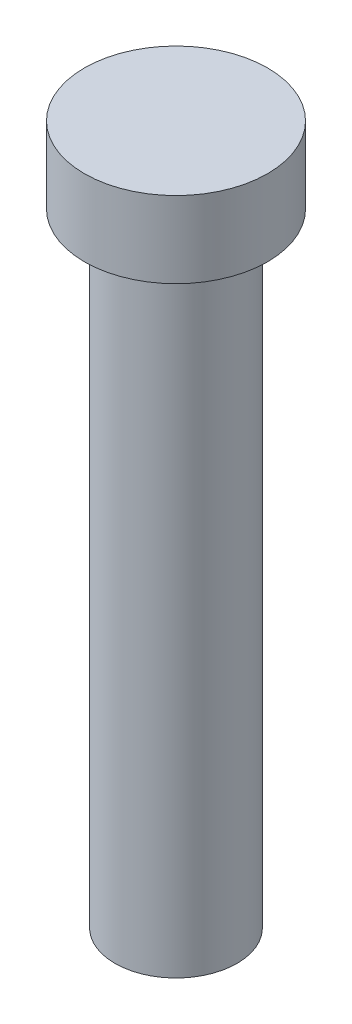
ISO-10303-21;
HEADER;
FILE_DESCRIPTION(('STEP AP214'),'2;1');
FILE_NAME('part.step','',(''),(''),'','','');
FILE_SCHEMA(('AUTOMOTIVE_DESIGN { 1 0 10303 214 1 1 1 1 }'));
ENDSEC;
DATA;
#1=APPLICATION_CONTEXT('core data for automotive mechanical design processes');
#2=APPLICATION_PROTOCOL_DEFINITION('international standard','automotive_design',2000,#1);
#3=PRODUCT_CONTEXT('',#1,'mechanical');
#4=PRODUCT('Part','Part','',(#3));
#5=PRODUCT_RELATED_PRODUCT_CATEGORY('part','',(#4));
#6=PRODUCT_DEFINITION_FORMATION('','',#4);
#7=PRODUCT_DEFINITION_CONTEXT('part definition',#1,'design');
#8=PRODUCT_DEFINITION('design','',#6,#7);
#9=PRODUCT_DEFINITION_SHAPE('','',#8);
#10=(LENGTH_UNIT() NAMED_UNIT(*) SI_UNIT(.MILLI.,.METRE.));
#11=(NAMED_UNIT(*) PLANE_ANGLE_UNIT() SI_UNIT($,.RADIAN.));
#12=(NAMED_UNIT(*) SI_UNIT($,.STERADIAN.) SOLID_ANGLE_UNIT());
#13=UNCERTAINTY_MEASURE_WITH_UNIT(LENGTH_MEASURE(1.E-05),#10,'distance_accuracy_value','');
#14=(GEOMETRIC_REPRESENTATION_CONTEXT(3) GLOBAL_UNCERTAINTY_ASSIGNED_CONTEXT((#13)) GLOBAL_UNIT_ASSIGNED_CONTEXT((#10,
#11,#12)) REPRESENTATION_CONTEXT('',''));
#15=CARTESIAN_POINT('',(0.,0.,0.));
#16=DIRECTION('',(0.,0.,1.));
#17=DIRECTION('',(1.,0.,0.));
#18=AXIS2_PLACEMENT_3D('',#15,#16,#17);
#19=CARTESIAN_POINT('',(0.,40.8,0.));
#20=DIRECTION('',(0.,-1.,0.));
#21=DIRECTION('',(0.,0.,-1.));
#22=AXIS2_PLACEMENT_3D('',#19,#20,#21);
#23=CYLINDRICAL_SURFACE('',#22,4.);
#24=CARTESIAN_POINT('',(0.,40.8,0.));
#25=DIRECTION('',(0.,1.,0.));
#26=DIRECTION('',(0.,0.,1.));
#27=AXIS2_PLACEMENT_3D('',#24,#25,#26);
#28=CIRCLE('',#27,4.);
#29=CARTESIAN_POINT('',(0.,40.8,4.));
#30=VERTEX_POINT('',#29);
#31=EDGE_CURVE('E10',#30,#30,#28,.T.);
#32=ORIENTED_EDGE('',*,*,#31,.F.);
#33=EDGE_LOOP('',(#32));
#34=FACE_BOUND('',#33,.T.);
#35=CARTESIAN_POINT('',(0.,0.,0.));
#36=DIRECTION('',(0.,1.,0.));
#37=DIRECTION('',(0.,0.,1.));
#38=AXIS2_PLACEMENT_3D('',#35,#36,#37);
#39=CIRCLE('',#38,4.);
#40=CARTESIAN_POINT('',(0.,0.,4.));
#41=VERTEX_POINT('',#40);
#42=EDGE_CURVE('E33',#41,#41,#39,.T.);
#43=ORIENTED_EDGE('',*,*,#42,.T.);
#44=EDGE_LOOP('',(#43));
#45=FACE_BOUND('',#44,.T.);
#46=ADVANCED_FACE('F30',(#34,#45),#23,.T.);
#47=CARTESIAN_POINT('',(0.,0.,0.));
#48=DIRECTION('',(0.,1.,0.));
#49=DIRECTION('',(0.,0.,1.));
#50=AXIS2_PLACEMENT_3D('',#47,#48,#49);
#51=PLANE('',#50);
#52=CARTESIAN_POINT('',(0.,0.,0.));
#53=DIRECTION('',(0.,-1.,0.));
#54=DIRECTION('',(0.,0.,-1.));
#55=AXIS2_PLACEMENT_3D('',#52,#53,#54);
#56=CIRCLE('',#55,1.5);
#57=CARTESIAN_POINT('',(0.,0.,-1.5));
#58=VERTEX_POINT('',#57);
#59=EDGE_CURVE('E48',#58,#58,#56,.T.);
#60=ORIENTED_EDGE('',*,*,#59,.F.);
#61=EDGE_LOOP('',(#60));
#62=FACE_BOUND('',#61,.T.);
#63=ORIENTED_EDGE('',*,*,#42,.F.);
#64=EDGE_LOOP('',(#63));
#65=FACE_BOUND('',#64,.T.);
#66=ADVANCED_FACE('F63',(#62,#65),#51,.F.);
#67=CARTESIAN_POINT('',(0.,45.8,0.));
#68=DIRECTION('',(0.,-1.,0.));
#69=DIRECTION('',(0.,0.,-1.));
#70=AXIS2_PLACEMENT_3D('',#67,#68,#69);
#71=CYLINDRICAL_SURFACE('',#70,6.);
#72=CARTESIAN_POINT('',(0.,45.8,0.));
#73=DIRECTION('',(0.,1.,0.));
#74=DIRECTION('',(0.,0.,1.));
#75=AXIS2_PLACEMENT_3D('',#72,#73,#74);
#76=CIRCLE('',#75,6.);
#77=CARTESIAN_POINT('',(0.,45.8,6.));
#78=VERTEX_POINT('',#77);
#79=EDGE_CURVE('E40',#78,#78,#76,.T.);
#80=ORIENTED_EDGE('',*,*,#79,.F.);
#81=EDGE_LOOP('',(#80));
#82=FACE_BOUND('',#81,.T.);
#83=CARTESIAN_POINT('',(0.,40.8,0.));
#84=DIRECTION('',(0.,1.,0.));
#85=DIRECTION('',(0.,0.,1.));
#86=AXIS2_PLACEMENT_3D('',#83,#84,#85);
#87=CIRCLE('',#86,6.);
#88=CARTESIAN_POINT('',(0.,40.8,6.));
#89=VERTEX_POINT('',#88);
#90=EDGE_CURVE('E42',#89,#89,#87,.T.);
#91=ORIENTED_EDGE('',*,*,#90,.T.);
#92=EDGE_LOOP('',(#91));
#93=FACE_BOUND('',#92,.T.);
#94=ADVANCED_FACE('F66',(#82,#93),#71,.T.);
#95=CARTESIAN_POINT('',(0.,45.8,0.));
#96=DIRECTION('',(0.,1.,0.));
#97=DIRECTION('',(0.,0.,1.));
#98=AXIS2_PLACEMENT_3D('',#95,#96,#97);
#99=PLANE('',#98);
#100=ORIENTED_EDGE('',*,*,#79,.T.);
#101=EDGE_LOOP('',(#100));
#102=FACE_BOUND('',#101,.T.);
#103=ADVANCED_FACE('F85',(#102),#99,.T.);
#104=CARTESIAN_POINT('',(0.,40.8,0.));
#105=DIRECTION('',(0.,1.,0.));
#106=DIRECTION('',(0.,0.,1.));
#107=AXIS2_PLACEMENT_3D('',#104,#105,#106);
#108=PLANE('',#107);
#109=ORIENTED_EDGE('',*,*,#31,.T.);
#110=EDGE_LOOP('',(#109));
#111=FACE_BOUND('',#110,.T.);
#112=ORIENTED_EDGE('',*,*,#90,.F.);
#113=EDGE_LOOP('',(#112));
#114=FACE_BOUND('',#113,.T.);
#115=ADVANCED_FACE('F59',(#111,#114),#108,.F.);
#116=CARTESIAN_POINT('',(0.,15.,0.));
#117=DIRECTION('',(0.,-1.,0.));
#118=DIRECTION('',(0.,0.,-1.));
#119=AXIS2_PLACEMENT_3D('',#116,#117,#118);
#120=CYLINDRICAL_SURFACE('',#119,1.5);
#121=CARTESIAN_POINT('',(0.,15.,0.));
#122=DIRECTION('',(0.,-1.,0.));
#123=DIRECTION('',(0.,0.,-1.));
#124=AXIS2_PLACEMENT_3D('',#121,#122,#123);
#125=CIRCLE('',#124,1.5);
#126=CARTESIAN_POINT('',(0.,15.,-1.5));
#127=VERTEX_POINT('',#126);
#128=EDGE_CURVE('E45',#127,#127,#125,.T.);
#129=ORIENTED_EDGE('',*,*,#128,.F.);
#130=EDGE_LOOP('',(#129));
#131=FACE_BOUND('',#130,.T.);
#132=ORIENTED_EDGE('',*,*,#59,.T.);
#133=EDGE_LOOP('',(#132));
#134=FACE_BOUND('',#133,.T.);
#135=ADVANCED_FACE('F56',(#131,#134),#120,.F.);
#136=CARTESIAN_POINT('',(0.,15.,0.));
#137=DIRECTION('',(0.,-1.,0.));
#138=DIRECTION('',(0.,0.,-1.));
#139=AXIS2_PLACEMENT_3D('',#136,#137,#138);
#140=PLANE('',#139);
#141=ORIENTED_EDGE('',*,*,#128,.T.);
#142=EDGE_LOOP('',(#141));
#143=FACE_BOUND('',#142,.T.);
#144=ADVANCED_FACE('F54',(#143),#140,.T.);
#145=CLOSED_SHELL('',(#46,#66,#94,#103,#115,#135,#144));
#146=MANIFOLD_SOLID_BREP('B2',#145);
#147=ADVANCED_BREP_SHAPE_REPRESENTATION('',(#18,#146),#14);
#148=SHAPE_DEFINITION_REPRESENTATION(#9,#147);
ENDSEC;
END-ISO-10303-21;
